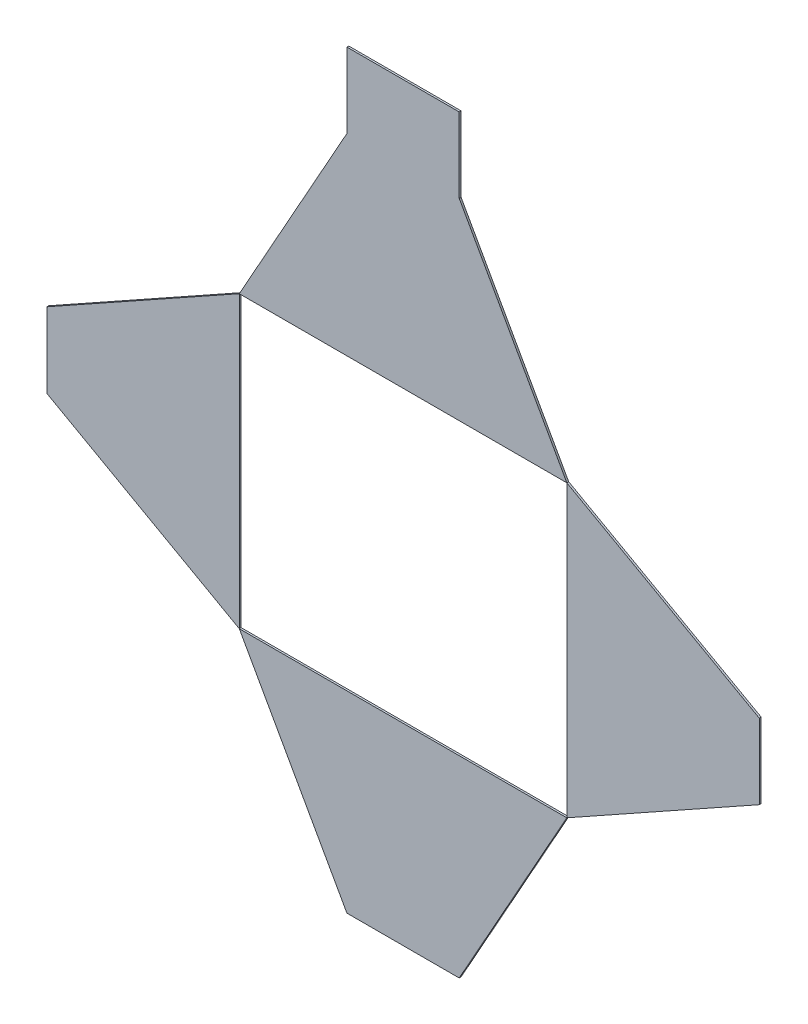
ISO-10303-21;
HEADER;
FILE_DESCRIPTION(('STEP AP214'),'2;1');
FILE_NAME('part.step','',(''),(''),'','','');
FILE_SCHEMA(('AUTOMOTIVE_DESIGN { 1 0 10303 214 1 1 1 1 }'));
ENDSEC;
DATA;
#1=APPLICATION_CONTEXT('core data for automotive mechanical design processes');
#2=APPLICATION_PROTOCOL_DEFINITION('international standard','automotive_design',2000,#1);
#3=PRODUCT_CONTEXT('',#1,'mechanical');
#4=PRODUCT('Part','Part','',(#3));
#5=PRODUCT_RELATED_PRODUCT_CATEGORY('part','',(#4));
#6=PRODUCT_DEFINITION_FORMATION('','',#4);
#7=PRODUCT_DEFINITION_CONTEXT('part definition',#1,'design');
#8=PRODUCT_DEFINITION('design','',#6,#7);
#9=PRODUCT_DEFINITION_SHAPE('','',#8);
#10=(LENGTH_UNIT() NAMED_UNIT(*) SI_UNIT(.MILLI.,.METRE.));
#11=(NAMED_UNIT(*) PLANE_ANGLE_UNIT() SI_UNIT($,.RADIAN.));
#12=(NAMED_UNIT(*) SI_UNIT($,.STERADIAN.) SOLID_ANGLE_UNIT());
#13=UNCERTAINTY_MEASURE_WITH_UNIT(LENGTH_MEASURE(1.E-05),#10,'distance_accuracy_value','');
#14=(GEOMETRIC_REPRESENTATION_CONTEXT(3) GLOBAL_UNCERTAINTY_ASSIGNED_CONTEXT((#13)) GLOBAL_UNIT_ASSIGNED_CONTEXT((#10,
#11,#12)) REPRESENTATION_CONTEXT('',''));
#15=CARTESIAN_POINT('',(0.,0.,0.));
#16=DIRECTION('',(0.,0.,1.));
#17=DIRECTION('',(1.,0.,0.));
#18=AXIS2_PLACEMENT_3D('',#15,#16,#17);
#19=CARTESIAN_POINT('',(-175.,0.,2.));
#20=DIRECTION('',(-1.,0.,0.));
#21=DIRECTION('',(0.,0.,1.));
#22=AXIS2_PLACEMENT_3D('',#19,#20,#21);
#23=PLANE('',#22);
#24=DIRECTION('',(0.,1.,0.));
#25=VECTOR('',#24,1.);
#26=CARTESIAN_POINT('',(-175.,0.,0.));
#27=LINE('',#26,#25);
#28=CARTESIAN_POINT('',(-175.,-155.,0.));
#29=VERTEX_POINT('',#28);
#30=CARTESIAN_POINT('',(-175.,155.,0.));
#31=VERTEX_POINT('',#30);
#32=EDGE_CURVE('E111',#29,#31,#27,.T.);
#33=ORIENTED_EDGE('',*,*,#32,.T.);
#34=DIRECTION('',(0.,0.,-1.));
#35=VECTOR('',#34,1.);
#36=CARTESIAN_POINT('',(-175.,155.,2.));
#37=LINE('',#36,#35);
#38=CARTESIAN_POINT('',(-175.,155.,2.));
#39=VERTEX_POINT('',#38);
#40=EDGE_CURVE('E12',#39,#31,#37,.T.);
#41=ORIENTED_EDGE('',*,*,#40,.F.);
#42=DIRECTION('',(0.,1.,0.));
#43=VECTOR('',#42,1.);
#44=CARTESIAN_POINT('',(-175.,0.,2.));
#45=LINE('',#44,#43);
#46=CARTESIAN_POINT('',(-175.,-155.,2.));
#47=VERTEX_POINT('',#46);
#48=EDGE_CURVE('E99',#47,#39,#45,.T.);
#49=ORIENTED_EDGE('',*,*,#48,.F.);
#50=DIRECTION('',(0.,0.,-1.));
#51=VECTOR('',#50,1.);
#52=CARTESIAN_POINT('',(-175.,-155.,2.));
#53=LINE('',#52,#51);
#54=EDGE_CURVE('E107',#47,#29,#53,.T.);
#55=ORIENTED_EDGE('',*,*,#54,.T.);
#56=EDGE_LOOP('',(#33,#41,#49,#55));
#57=FACE_BOUND('',#56,.T.);
#58=ADVANCED_FACE('F48',(#57),#23,.F.);
#59=CARTESIAN_POINT('',(-107.672917099578,192.632764301451,2.));
#60=DIRECTION('',(0.487908358082308,-0.872894858567414,0.));
#61=DIRECTION('',(0.872894858567415,0.487908358082308,0.));
#62=AXIS2_PLACEMENT_3D('',#59,#60,#61);
#63=PLANE('',#62);
#64=DIRECTION('',(-0.872894858567415,-0.487908358082308,0.));
#65=VECTOR('',#64,1.);
#66=CARTESIAN_POINT('',(-107.672917099578,192.632764301451,0.));
#67=LINE('',#66,#65);
#68=CARTESIAN_POINT('',(-380.74131816434,40.0000000000001,0.));
#69=VERTEX_POINT('',#68);
#70=EDGE_CURVE('E103',#31,#69,#67,.T.);
#71=ORIENTED_EDGE('',*,*,#70,.T.);
#72=DIRECTION('',(0.,0.,-1.));
#73=VECTOR('',#72,1.);
#74=CARTESIAN_POINT('',(-380.74131816434,40.0000000000001,2.));
#75=LINE('',#74,#73);
#76=CARTESIAN_POINT('',(-380.74131816434,40.0000000000001,2.));
#77=VERTEX_POINT('',#76);
#78=EDGE_CURVE('E56',#77,#69,#75,.T.);
#79=ORIENTED_EDGE('',*,*,#78,.F.);
#80=DIRECTION('',(-0.872894858567415,-0.487908358082308,0.));
#81=VECTOR('',#80,1.);
#82=CARTESIAN_POINT('',(-107.672917099578,192.632764301451,2.));
#83=LINE('',#82,#81);
#84=EDGE_CURVE('E94',#39,#77,#83,.T.);
#85=ORIENTED_EDGE('',*,*,#84,.F.);
#86=ORIENTED_EDGE('',*,*,#40,.T.);
#87=EDGE_LOOP('',(#71,#79,#85,#86));
#88=FACE_BOUND('',#87,.T.);
#89=ADVANCED_FACE('F102',(#88),#63,.F.);
#90=CARTESIAN_POINT('',(-380.74131816434,0.,2.));
#91=DIRECTION('',(1.,0.,0.));
#92=DIRECTION('',(0.,0.,-1.));
#93=AXIS2_PLACEMENT_3D('',#90,#91,#92);
#94=PLANE('',#93);
#95=DIRECTION('',(0.,-1.,0.));
#96=VECTOR('',#95,1.);
#97=CARTESIAN_POINT('',(-380.74131816434,0.,0.));
#98=LINE('',#97,#96);
#99=CARTESIAN_POINT('',(-380.741318164339,-39.9999999999999,0.));
#100=VERTEX_POINT('',#99);
#101=EDGE_CURVE('E81',#69,#100,#98,.T.);
#102=ORIENTED_EDGE('',*,*,#101,.T.);
#103=DIRECTION('',(0.,0.,-1.));
#104=VECTOR('',#103,1.);
#105=CARTESIAN_POINT('',(-380.741318164339,-39.9999999999999,2.));
#106=LINE('',#105,#104);
#107=CARTESIAN_POINT('',(-380.741318164339,-39.9999999999999,2.));
#108=VERTEX_POINT('',#107);
#109=EDGE_CURVE('E104',#108,#100,#106,.T.);
#110=ORIENTED_EDGE('',*,*,#109,.F.);
#111=DIRECTION('',(0.,-1.,0.));
#112=VECTOR('',#111,1.);
#113=CARTESIAN_POINT('',(-380.74131816434,0.,2.));
#114=LINE('',#113,#112);
#115=EDGE_CURVE('E97',#77,#108,#114,.T.);
#116=ORIENTED_EDGE('',*,*,#115,.F.);
#117=ORIENTED_EDGE('',*,*,#78,.T.);
#118=EDGE_LOOP('',(#102,#110,#116,#117));
#119=FACE_BOUND('',#118,.T.);
#120=ADVANCED_FACE('F105',(#119),#94,.F.);
#121=CARTESIAN_POINT('',(-107.672917099578,-192.632764301451,2.));
#122=DIRECTION('',(0.487908358082308,0.872894858567414,0.));
#123=DIRECTION('',(-0.872894858567414,0.487908358082308,0.));
#124=AXIS2_PLACEMENT_3D('',#121,#122,#123);
#125=PLANE('',#124);
#126=DIRECTION('',(0.872894858567414,-0.487908358082308,0.));
#127=VECTOR('',#126,1.);
#128=CARTESIAN_POINT('',(-107.672917099578,-192.632764301451,0.));
#129=LINE('',#128,#127);
#130=EDGE_CURVE('E87',#100,#29,#129,.T.);
#131=ORIENTED_EDGE('',*,*,#130,.T.);
#132=ORIENTED_EDGE('',*,*,#54,.F.);
#133=DIRECTION('',(0.872894858567414,-0.487908358082308,0.));
#134=VECTOR('',#133,1.);
#135=CARTESIAN_POINT('',(-107.672917099578,-192.632764301451,2.));
#136=LINE('',#135,#134);
#137=EDGE_CURVE('E64',#108,#47,#136,.T.);
#138=ORIENTED_EDGE('',*,*,#137,.F.);
#139=ORIENTED_EDGE('',*,*,#109,.T.);
#140=EDGE_LOOP('',(#131,#132,#138,#139));
#141=FACE_BOUND('',#140,.T.);
#142=ADVANCED_FACE('F118',(#141),#125,.F.);
#143=CARTESIAN_POINT('',(0.,0.,2.));
#144=DIRECTION('',(0.,0.,1.));
#145=DIRECTION('',(1.,0.,0.));
#146=AXIS2_PLACEMENT_3D('',#143,#144,#145);
#147=PLANE('',#146);
#148=ORIENTED_EDGE('',*,*,#48,.T.);
#149=ORIENTED_EDGE('',*,*,#84,.T.);
#150=ORIENTED_EDGE('',*,*,#115,.T.);
#151=ORIENTED_EDGE('',*,*,#137,.T.);
#152=EDGE_LOOP('',(#148,#149,#150,#151));
#153=FACE_BOUND('',#152,.T.);
#154=ADVANCED_FACE('F95',(#153),#147,.T.);
#155=CARTESIAN_POINT('',(0.,0.,0.));
#156=DIRECTION('',(0.,0.,1.));
#157=DIRECTION('',(1.,0.,0.));
#158=AXIS2_PLACEMENT_3D('',#155,#156,#157);
#159=PLANE('',#158);
#160=ORIENTED_EDGE('',*,*,#32,.F.);
#161=ORIENTED_EDGE('',*,*,#130,.F.);
#162=ORIENTED_EDGE('',*,*,#101,.F.);
#163=ORIENTED_EDGE('',*,*,#70,.F.);
#164=EDGE_LOOP('',(#160,#161,#162,#163));
#165=FACE_BOUND('',#164,.T.);
#166=ADVANCED_FACE('F121',(#165),#159,.F.);
#167=CLOSED_SHELL('',(#58,#89,#120,#142,#154,#166));
#168=MANIFOLD_SOLID_BREP('B2',#167);
#169=CARTESIAN_POINT('',(-199.353819039278,-111.429679726289,2.));
#170=DIRECTION('',(-0.872894858567414,-0.487908358082308,0.));
#171=DIRECTION('',(0.487908358082308,-0.872894858567414,0.));
#172=AXIS2_PLACEMENT_3D('',#169,#170,#171);
#173=PLANE('',#172);
#174=DIRECTION('',(-0.487908358082308,0.872894858567414,0.));
#175=VECTOR('',#174,1.);
#176=CARTESIAN_POINT('',(-199.353819039278,-111.429679726289,0.));
#177=LINE('',#176,#175);
#178=CARTESIAN_POINT('',(-59.9999999999999,-360.74131816434,0.));
#179=VERTEX_POINT('',#178);
#180=CARTESIAN_POINT('',(-175.,-155.,0.));
#181=VERTEX_POINT('',#180);
#182=EDGE_CURVE('E244',#179,#181,#177,.T.);
#183=ORIENTED_EDGE('',*,*,#182,.F.);
#184=DIRECTION('',(0.,0.,-1.));
#185=VECTOR('',#184,1.);
#186=CARTESIAN_POINT('',(-59.9999999999999,-360.74131816434,2.));
#187=LINE('',#186,#185);
#188=CARTESIAN_POINT('',(-59.9999999999999,-360.74131816434,2.));
#189=VERTEX_POINT('',#188);
#190=EDGE_CURVE('E46',#189,#179,#187,.T.);
#191=ORIENTED_EDGE('',*,*,#190,.F.);
#192=DIRECTION('',(-0.487908358082308,0.872894858567414,0.));
#193=VECTOR('',#192,1.);
#194=CARTESIAN_POINT('',(-199.353819039278,-111.429679726289,2.));
#195=LINE('',#194,#193);
#196=CARTESIAN_POINT('',(-175.,-155.,2.));
#197=VERTEX_POINT('',#196);
#198=EDGE_CURVE('E232',#189,#197,#195,.T.);
#199=ORIENTED_EDGE('',*,*,#198,.T.);
#200=DIRECTION('',(0.,0.,-1.));
#201=VECTOR('',#200,1.);
#202=CARTESIAN_POINT('',(-175.,-155.,2.));
#203=LINE('',#202,#201);
#204=EDGE_CURVE('E221',#197,#181,#203,.T.);
#205=ORIENTED_EDGE('',*,*,#204,.T.);
#206=EDGE_LOOP('',(#183,#191,#199,#205));
#207=FACE_BOUND('',#206,.T.);
#208=ADVANCED_FACE('F182',(#207),#173,.T.);
#209=CARTESIAN_POINT('',(3.33752764466399E-13,-360.74131816434,2.));
#210=DIRECTION('',(0.,1.,0.));
#211=DIRECTION('',(-1.,0.,0.));
#212=AXIS2_PLACEMENT_3D('',#209,#210,#211);
#213=PLANE('',#212);
#214=DIRECTION('',(1.,0.,0.));
#215=VECTOR('',#214,1.);
#216=CARTESIAN_POINT('',(3.33752764466399E-13,-360.74131816434,0.));
#217=LINE('',#216,#215);
#218=CARTESIAN_POINT('',(60.0000000000001,-360.741318164339,0.));
#219=VERTEX_POINT('',#218);
#220=EDGE_CURVE('E237',#179,#219,#217,.T.);
#221=ORIENTED_EDGE('',*,*,#220,.T.);
#222=DIRECTION('',(0.,0.,-1.));
#223=VECTOR('',#222,1.);
#224=CARTESIAN_POINT('',(60.0000000000001,-360.741318164339,2.));
#225=LINE('',#224,#223);
#226=CARTESIAN_POINT('',(60.0000000000001,-360.741318164339,2.));
#227=VERTEX_POINT('',#226);
#228=EDGE_CURVE('E190',#227,#219,#225,.T.);
#229=ORIENTED_EDGE('',*,*,#228,.F.);
#230=DIRECTION('',(1.,0.,0.));
#231=VECTOR('',#230,1.);
#232=CARTESIAN_POINT('',(3.33752764466399E-13,-360.74131816434,2.));
#233=LINE('',#232,#231);
#234=EDGE_CURVE('E227',#189,#227,#233,.T.);
#235=ORIENTED_EDGE('',*,*,#234,.F.);
#236=ORIENTED_EDGE('',*,*,#190,.T.);
#237=EDGE_LOOP('',(#221,#229,#235,#236));
#238=FACE_BOUND('',#237,.T.);
#239=ADVANCED_FACE('F235',(#238),#213,.F.);
#240=CARTESIAN_POINT('',(199.353819039278,-111.429679726289,2.));
#241=DIRECTION('',(-0.872894858567415,0.487908358082308,0.));
#242=DIRECTION('',(-0.487908358082308,-0.872894858567415,0.));
#243=AXIS2_PLACEMENT_3D('',#240,#241,#242);
#244=PLANE('',#243);
#245=DIRECTION('',(0.487908358082308,0.872894858567415,0.));
#246=VECTOR('',#245,1.);
#247=CARTESIAN_POINT('',(199.353819039278,-111.429679726289,0.));
#248=LINE('',#247,#246);
#249=CARTESIAN_POINT('',(175.,-155.,0.));
#250=VERTEX_POINT('',#249);
#251=EDGE_CURVE('E214',#219,#250,#248,.T.);
#252=ORIENTED_EDGE('',*,*,#251,.T.);
#253=DIRECTION('',(0.,0.,-1.));
#254=VECTOR('',#253,1.);
#255=CARTESIAN_POINT('',(175.,-155.,2.));
#256=LINE('',#255,#254);
#257=CARTESIAN_POINT('',(175.,-155.,2.));
#258=VERTEX_POINT('',#257);
#259=EDGE_CURVE('E238',#258,#250,#256,.T.);
#260=ORIENTED_EDGE('',*,*,#259,.F.);
#261=DIRECTION('',(0.487908358082308,0.872894858567415,0.));
#262=VECTOR('',#261,1.);
#263=CARTESIAN_POINT('',(199.353819039278,-111.429679726289,2.));
#264=LINE('',#263,#262);
#265=EDGE_CURVE('E231',#227,#258,#264,.T.);
#266=ORIENTED_EDGE('',*,*,#265,.F.);
#267=ORIENTED_EDGE('',*,*,#228,.T.);
#268=EDGE_LOOP('',(#252,#260,#266,#267));
#269=FACE_BOUND('',#268,.T.);
#270=ADVANCED_FACE('F239',(#269),#244,.F.);
#271=CARTESIAN_POINT('',(0.,-155.,2.));
#272=DIRECTION('',(0.,-1.,0.));
#273=DIRECTION('',(1.,0.,0.));
#274=AXIS2_PLACEMENT_3D('',#271,#272,#273);
#275=PLANE('',#274);
#276=DIRECTION('',(-1.,0.,0.));
#277=VECTOR('',#276,1.);
#278=CARTESIAN_POINT('',(0.,-155.,0.));
#279=LINE('',#278,#277);
#280=EDGE_CURVE('E249',#250,#181,#279,.T.);
#281=ORIENTED_EDGE('',*,*,#280,.T.);
#282=ORIENTED_EDGE('',*,*,#204,.F.);
#283=DIRECTION('',(-1.,0.,0.));
#284=VECTOR('',#283,1.);
#285=CARTESIAN_POINT('',(0.,-155.,2.));
#286=LINE('',#285,#284);
#287=EDGE_CURVE('E198',#258,#197,#286,.T.);
#288=ORIENTED_EDGE('',*,*,#287,.F.);
#289=ORIENTED_EDGE('',*,*,#259,.T.);
#290=EDGE_LOOP('',(#281,#282,#288,#289));
#291=FACE_BOUND('',#290,.T.);
#292=ADVANCED_FACE('F254',(#291),#275,.F.);
#293=CARTESIAN_POINT('',(0.,0.,2.));
#294=DIRECTION('',(0.,0.,1.));
#295=DIRECTION('',(1.,0.,0.));
#296=AXIS2_PLACEMENT_3D('',#293,#294,#295);
#297=PLANE('',#296);
#298=ORIENTED_EDGE('',*,*,#198,.F.);
#299=ORIENTED_EDGE('',*,*,#234,.T.);
#300=ORIENTED_EDGE('',*,*,#265,.T.);
#301=ORIENTED_EDGE('',*,*,#287,.T.);
#302=EDGE_LOOP('',(#298,#299,#300,#301));
#303=FACE_BOUND('',#302,.T.);
#304=ADVANCED_FACE('F229',(#303),#297,.T.);
#305=CARTESIAN_POINT('',(0.,0.,0.));
#306=DIRECTION('',(0.,0.,1.));
#307=DIRECTION('',(1.,0.,0.));
#308=AXIS2_PLACEMENT_3D('',#305,#306,#307);
#309=PLANE('',#308);
#310=ORIENTED_EDGE('',*,*,#182,.T.);
#311=ORIENTED_EDGE('',*,*,#280,.F.);
#312=ORIENTED_EDGE('',*,*,#251,.F.);
#313=ORIENTED_EDGE('',*,*,#220,.F.);
#314=EDGE_LOOP('',(#310,#311,#312,#313));
#315=FACE_BOUND('',#314,.T.);
#316=ADVANCED_FACE('F256',(#315),#309,.F.);
#317=CLOSED_SHELL('',(#208,#239,#270,#292,#304,#316));
#318=MANIFOLD_SOLID_BREP('B6',#317);
#319=CARTESIAN_POINT('',(107.672917099578,-192.632764301451,2.));
#320=DIRECTION('',(0.487908358082308,-0.872894858567414,0.));
#321=DIRECTION('',(0.872894858567414,0.487908358082308,0.));
#322=AXIS2_PLACEMENT_3D('',#319,#320,#321);
#323=PLANE('',#322);
#324=DIRECTION('',(-0.872894858567414,-0.487908358082308,0.));
#325=VECTOR('',#324,1.);
#326=CARTESIAN_POINT('',(107.672917099578,-192.632764301451,0.));
#327=LINE('',#326,#325);
#328=CARTESIAN_POINT('',(380.74131816434,-39.9999999999999,0.));
#329=VERTEX_POINT('',#328);
#330=CARTESIAN_POINT('',(175.,-155.,0.));
#331=VERTEX_POINT('',#330);
#332=EDGE_CURVE('E378',#329,#331,#327,.T.);
#333=ORIENTED_EDGE('',*,*,#332,.F.);
#334=DIRECTION('',(0.,0.,-1.));
#335=VECTOR('',#334,1.);
#336=CARTESIAN_POINT('',(380.74131816434,-39.9999999999999,2.));
#337=LINE('',#336,#335);
#338=CARTESIAN_POINT('',(380.74131816434,-39.9999999999999,2.));
#339=VERTEX_POINT('',#338);
#340=EDGE_CURVE('E180',#339,#329,#337,.T.);
#341=ORIENTED_EDGE('',*,*,#340,.F.);
#342=DIRECTION('',(-0.872894858567414,-0.487908358082308,0.));
#343=VECTOR('',#342,1.);
#344=CARTESIAN_POINT('',(107.672917099578,-192.632764301451,2.));
#345=LINE('',#344,#343);
#346=CARTESIAN_POINT('',(175.,-155.,2.));
#347=VERTEX_POINT('',#346);
#348=EDGE_CURVE('E370',#339,#347,#345,.T.);
#349=ORIENTED_EDGE('',*,*,#348,.T.);
#350=DIRECTION('',(0.,0.,-1.));
#351=VECTOR('',#350,1.);
#352=CARTESIAN_POINT('',(175.,-155.,2.));
#353=LINE('',#352,#351);
#354=EDGE_CURVE('E331',#347,#331,#353,.T.);
#355=ORIENTED_EDGE('',*,*,#354,.T.);
#356=EDGE_LOOP('',(#333,#341,#349,#355));
#357=FACE_BOUND('',#356,.T.);
#358=ADVANCED_FACE('F315',(#357),#323,.T.);
#359=CARTESIAN_POINT('',(380.74131816434,0.,2.));
#360=DIRECTION('',(1.,0.,0.));
#361=DIRECTION('',(0.,0.,-1.));
#362=AXIS2_PLACEMENT_3D('',#359,#360,#361);
#363=PLANE('',#362);
#364=DIRECTION('',(0.,-1.,0.));
#365=VECTOR('',#364,1.);
#366=CARTESIAN_POINT('',(380.74131816434,0.,0.));
#367=LINE('',#366,#365);
#368=CARTESIAN_POINT('',(380.74131816434,40.0000000000001,0.));
#369=VERTEX_POINT('',#368);
#370=EDGE_CURVE('E361',#369,#329,#367,.T.);
#371=ORIENTED_EDGE('',*,*,#370,.F.);
#372=DIRECTION('',(0.,0.,-1.));
#373=VECTOR('',#372,1.);
#374=CARTESIAN_POINT('',(380.74131816434,40.0000000000001,2.));
#375=LINE('',#374,#373);
#376=CARTESIAN_POINT('',(380.74131816434,40.0000000000001,2.));
#377=VERTEX_POINT('',#376);
#378=EDGE_CURVE('E323',#377,#369,#375,.T.);
#379=ORIENTED_EDGE('',*,*,#378,.F.);
#380=DIRECTION('',(0.,-1.,0.));
#381=VECTOR('',#380,1.);
#382=CARTESIAN_POINT('',(380.74131816434,0.,2.));
#383=LINE('',#382,#381);
#384=EDGE_CURVE('E359',#377,#339,#383,.T.);
#385=ORIENTED_EDGE('',*,*,#384,.T.);
#386=ORIENTED_EDGE('',*,*,#340,.T.);
#387=EDGE_LOOP('',(#371,#379,#385,#386));
#388=FACE_BOUND('',#387,.T.);
#389=ADVANCED_FACE('F358',(#388),#363,.T.);
#390=CARTESIAN_POINT('',(107.672917099578,192.632764301451,2.));
#391=DIRECTION('',(0.487908358082308,0.872894858567414,0.));
#392=DIRECTION('',(-0.872894858567414,0.487908358082308,0.));
#393=AXIS2_PLACEMENT_3D('',#390,#391,#392);
#394=PLANE('',#393);
#395=DIRECTION('',(0.872894858567414,-0.487908358082308,0.));
#396=VECTOR('',#395,1.);
#397=CARTESIAN_POINT('',(107.672917099578,192.632764301451,0.));
#398=LINE('',#397,#396);
#399=CARTESIAN_POINT('',(175.,155.,0.));
#400=VERTEX_POINT('',#399);
#401=EDGE_CURVE('E381',#400,#369,#398,.T.);
#402=ORIENTED_EDGE('',*,*,#401,.F.);
#403=DIRECTION('',(0.,0.,-1.));
#404=VECTOR('',#403,1.);
#405=CARTESIAN_POINT('',(175.,155.,2.));
#406=LINE('',#405,#404);
#407=CARTESIAN_POINT('',(175.,155.,2.));
#408=VERTEX_POINT('',#407);
#409=EDGE_CURVE('E344',#408,#400,#406,.T.);
#410=ORIENTED_EDGE('',*,*,#409,.F.);
#411=DIRECTION('',(0.872894858567414,-0.487908358082308,0.));
#412=VECTOR('',#411,1.);
#413=CARTESIAN_POINT('',(107.672917099578,192.632764301451,2.));
#414=LINE('',#413,#412);
#415=EDGE_CURVE('E369',#408,#377,#414,.T.);
#416=ORIENTED_EDGE('',*,*,#415,.T.);
#417=ORIENTED_EDGE('',*,*,#378,.T.);
#418=EDGE_LOOP('',(#402,#410,#416,#417));
#419=FACE_BOUND('',#418,.T.);
#420=ADVANCED_FACE('F372',(#419),#394,.T.);
#421=CARTESIAN_POINT('',(175.,0.,2.));
#422=DIRECTION('',(-1.,0.,0.));
#423=DIRECTION('',(0.,0.,1.));
#424=AXIS2_PLACEMENT_3D('',#421,#422,#423);
#425=PLANE('',#424);
#426=DIRECTION('',(0.,1.,0.));
#427=VECTOR('',#426,1.);
#428=CARTESIAN_POINT('',(175.,0.,0.));
#429=LINE('',#428,#427);
#430=EDGE_CURVE('E383',#331,#400,#429,.T.);
#431=ORIENTED_EDGE('',*,*,#430,.F.);
#432=ORIENTED_EDGE('',*,*,#354,.F.);
#433=DIRECTION('',(0.,1.,0.));
#434=VECTOR('',#433,1.);
#435=CARTESIAN_POINT('',(175.,0.,2.));
#436=LINE('',#435,#434);
#437=EDGE_CURVE('E373',#347,#408,#436,.T.);
#438=ORIENTED_EDGE('',*,*,#437,.T.);
#439=ORIENTED_EDGE('',*,*,#409,.T.);
#440=EDGE_LOOP('',(#431,#432,#438,#439));
#441=FACE_BOUND('',#440,.T.);
#442=ADVANCED_FACE('F388',(#441),#425,.T.);
#443=CARTESIAN_POINT('',(0.,0.,2.));
#444=DIRECTION('',(0.,0.,1.));
#445=DIRECTION('',(1.,0.,0.));
#446=AXIS2_PLACEMENT_3D('',#443,#444,#445);
#447=PLANE('',#446);
#448=ORIENTED_EDGE('',*,*,#348,.F.);
#449=ORIENTED_EDGE('',*,*,#384,.F.);
#450=ORIENTED_EDGE('',*,*,#415,.F.);
#451=ORIENTED_EDGE('',*,*,#437,.F.);
#452=EDGE_LOOP('',(#448,#449,#450,#451));
#453=FACE_BOUND('',#452,.T.);
#454=ADVANCED_FACE('F367',(#453),#447,.T.);
#455=CARTESIAN_POINT('',(0.,0.,0.));
#456=DIRECTION('',(0.,0.,1.));
#457=DIRECTION('',(1.,0.,0.));
#458=AXIS2_PLACEMENT_3D('',#455,#456,#457);
#459=PLANE('',#458);
#460=ORIENTED_EDGE('',*,*,#332,.T.);
#461=ORIENTED_EDGE('',*,*,#430,.T.);
#462=ORIENTED_EDGE('',*,*,#401,.T.);
#463=ORIENTED_EDGE('',*,*,#370,.T.);
#464=EDGE_LOOP('',(#460,#461,#462,#463));
#465=FACE_BOUND('',#464,.T.);
#466=ADVANCED_FACE('F395',(#465),#459,.F.);
#467=CLOSED_SHELL('',(#358,#389,#420,#442,#454,#466));
#468=MANIFOLD_SOLID_BREP('B40',#467);
#469=CARTESIAN_POINT('',(59.9999999999999,0.,2.));
#470=DIRECTION('',(1.,0.,0.));
#471=DIRECTION('',(0.,1.,0.));
#472=AXIS2_PLACEMENT_3D('',#469,#470,#471);
#473=PLANE('',#472);
#474=DIRECTION('',(0.,-1.,0.));
#475=VECTOR('',#474,1.);
#476=CARTESIAN_POINT('',(59.9999999999999,0.,0.));
#477=LINE('',#476,#475);
#478=CARTESIAN_POINT('',(60.,440.74131816434,0.));
#479=VERTEX_POINT('',#478);
#480=CARTESIAN_POINT('',(60.,360.74131816434,0.));
#481=VERTEX_POINT('',#480);
#482=EDGE_CURVE('E520',#479,#481,#477,.T.);
#483=ORIENTED_EDGE('',*,*,#482,.F.);
#484=DIRECTION('',(0.,0.,-1.));
#485=VECTOR('',#484,1.);
#486=CARTESIAN_POINT('',(60.,440.74131816434,2.));
#487=LINE('',#486,#485);
#488=CARTESIAN_POINT('',(60.,440.74131816434,2.));
#489=VERTEX_POINT('',#488);
#490=EDGE_CURVE('E313',#489,#479,#487,.T.);
#491=ORIENTED_EDGE('',*,*,#490,.F.);
#492=DIRECTION('',(0.,-1.,0.));
#493=VECTOR('',#492,1.);
#494=CARTESIAN_POINT('',(59.9999999999999,0.,2.));
#495=LINE('',#494,#493);
#496=CARTESIAN_POINT('',(60.,360.74131816434,2.));
#497=VERTEX_POINT('',#496);
#498=EDGE_CURVE('E534',#489,#497,#495,.T.);
#499=ORIENTED_EDGE('',*,*,#498,.T.);
#500=DIRECTION('',(0.,0.,-1.));
#501=VECTOR('',#500,1.);
#502=CARTESIAN_POINT('',(60.,360.74131816434,2.));
#503=LINE('',#502,#501);
#504=EDGE_CURVE('E455',#497,#481,#503,.T.);
#505=ORIENTED_EDGE('',*,*,#504,.T.);
#506=EDGE_LOOP('',(#483,#491,#499,#505));
#507=FACE_BOUND('',#506,.T.);
#508=ADVANCED_FACE('F439',(#507),#473,.T.);
#509=CARTESIAN_POINT('',(0.,440.74131816434,2.));
#510=DIRECTION('',(0.,1.,0.));
#511=DIRECTION('',(0.,0.,1.));
#512=AXIS2_PLACEMENT_3D('',#509,#510,#511);
#513=PLANE('',#512);
#514=DIRECTION('',(1.,0.,0.));
#515=VECTOR('',#514,1.);
#516=CARTESIAN_POINT('',(0.,440.74131816434,0.));
#517=LINE('',#516,#515);
#518=CARTESIAN_POINT('',(-60.,440.74131816434,0.));
#519=VERTEX_POINT('',#518);
#520=EDGE_CURVE('E522',#519,#479,#517,.T.);
#521=ORIENTED_EDGE('',*,*,#520,.F.);
#522=DIRECTION('',(0.,0.,-1.));
#523=VECTOR('',#522,1.);
#524=CARTESIAN_POINT('',(-60.,440.74131816434,2.));
#525=LINE('',#524,#523);
#526=CARTESIAN_POINT('',(-60.,440.74131816434,2.));
#527=VERTEX_POINT('',#526);
#528=EDGE_CURVE('E447',#527,#519,#525,.T.);
#529=ORIENTED_EDGE('',*,*,#528,.F.);
#530=DIRECTION('',(1.,0.,0.));
#531=VECTOR('',#530,1.);
#532=CARTESIAN_POINT('',(0.,440.74131816434,2.));
#533=LINE('',#532,#531);
#534=EDGE_CURVE('E615',#527,#489,#533,.T.);
#535=ORIENTED_EDGE('',*,*,#534,.T.);
#536=ORIENTED_EDGE('',*,*,#490,.T.);
#537=EDGE_LOOP('',(#521,#529,#535,#536));
#538=FACE_BOUND('',#537,.T.);
#539=ADVANCED_FACE('F543',(#538),#513,.T.);
#540=CARTESIAN_POINT('',(-59.9999999999999,0.,2.));
#541=DIRECTION('',(-1.,0.,0.));
#542=DIRECTION('',(0.,-1.,0.));
#543=AXIS2_PLACEMENT_3D('',#540,#541,#542);
#544=PLANE('',#543);
#545=DIRECTION('',(0.,1.,0.));
#546=VECTOR('',#545,1.);
#547=CARTESIAN_POINT('',(-59.9999999999999,0.,0.));
#548=LINE('',#547,#546);
#549=CARTESIAN_POINT('',(-60.,360.74131816434,0.));
#550=VERTEX_POINT('',#549);
#551=EDGE_CURVE('E525',#550,#519,#548,.T.);
#552=ORIENTED_EDGE('',*,*,#551,.F.);
#553=DIRECTION('',(0.,0.,-1.));
#554=VECTOR('',#553,1.);
#555=CARTESIAN_POINT('',(-60.,360.74131816434,2.));
#556=LINE('',#555,#554);
#557=CARTESIAN_POINT('',(-60.,360.74131816434,2.));
#558=VERTEX_POINT('',#557);
#559=EDGE_CURVE('E512',#558,#550,#556,.T.);
#560=ORIENTED_EDGE('',*,*,#559,.F.);
#561=DIRECTION('',(0.,1.,0.));
#562=VECTOR('',#561,1.);
#563=CARTESIAN_POINT('',(-59.9999999999999,0.,2.));
#564=LINE('',#563,#562);
#565=EDGE_CURVE('E502',#558,#527,#564,.T.);
#566=ORIENTED_EDGE('',*,*,#565,.T.);
#567=ORIENTED_EDGE('',*,*,#528,.T.);
#568=EDGE_LOOP('',(#552,#560,#566,#567));
#569=FACE_BOUND('',#568,.T.);
#570=ADVANCED_FACE('F540',(#569),#544,.T.);
#571=CARTESIAN_POINT('',(-199.353819039278,111.429679726289,2.));
#572=DIRECTION('',(0.872894858567414,-0.487908358082308,0.));
#573=DIRECTION('',(0.487908358082308,0.872894858567414,0.));
#574=AXIS2_PLACEMENT_3D('',#571,#572,#573);
#575=PLANE('',#574);
#576=DIRECTION('',(-0.487908358082308,-0.872894858567414,0.));
#577=VECTOR('',#576,1.);
#578=CARTESIAN_POINT('',(-199.353819039278,111.429679726289,0.));
#579=LINE('',#578,#577);
#580=CARTESIAN_POINT('',(-175.,155.,0.));
#581=VERTEX_POINT('',#580);
#582=EDGE_CURVE('E509',#550,#581,#579,.T.);
#583=ORIENTED_EDGE('',*,*,#582,.T.);
#584=DIRECTION('',(0.,0.,-1.));
#585=VECTOR('',#584,1.);
#586=CARTESIAN_POINT('',(-175.,155.,2.));
#587=LINE('',#586,#585);
#588=CARTESIAN_POINT('',(-175.,155.,2.));
#589=VERTEX_POINT('',#588);
#590=EDGE_CURVE('E506',#589,#581,#587,.T.);
#591=ORIENTED_EDGE('',*,*,#590,.F.);
#592=DIRECTION('',(-0.487908358082308,-0.872894858567414,0.));
#593=VECTOR('',#592,1.);
#594=CARTESIAN_POINT('',(-199.353819039278,111.429679726289,2.));
#595=LINE('',#594,#593);
#596=EDGE_CURVE('E494',#558,#589,#595,.T.);
#597=ORIENTED_EDGE('',*,*,#596,.F.);
#598=ORIENTED_EDGE('',*,*,#559,.T.);
#599=EDGE_LOOP('',(#583,#591,#597,#598));
#600=FACE_BOUND('',#599,.T.);
#601=ADVANCED_FACE('F507',(#600),#575,.F.);
#602=CARTESIAN_POINT('',(0.,155.,2.));
#603=DIRECTION('',(0.,-1.,0.));
#604=DIRECTION('',(1.,0.,0.));
#605=AXIS2_PLACEMENT_3D('',#602,#603,#604);
#606=PLANE('',#605);
#607=DIRECTION('',(-1.,0.,0.));
#608=VECTOR('',#607,1.);
#609=CARTESIAN_POINT('',(0.,155.,0.));
#610=LINE('',#609,#608);
#611=CARTESIAN_POINT('',(175.,155.,0.));
#612=VERTEX_POINT('',#611);
#613=EDGE_CURVE('E529',#612,#581,#610,.T.);
#614=ORIENTED_EDGE('',*,*,#613,.F.);
#615=DIRECTION('',(0.,0.,-1.));
#616=VECTOR('',#615,1.);
#617=CARTESIAN_POINT('',(175.,155.,2.));
#618=LINE('',#617,#616);
#619=CARTESIAN_POINT('',(175.,155.,2.));
#620=VERTEX_POINT('',#619);
#621=EDGE_CURVE('E474',#620,#612,#618,.T.);
#622=ORIENTED_EDGE('',*,*,#621,.F.);
#623=DIRECTION('',(-1.,0.,0.));
#624=VECTOR('',#623,1.);
#625=CARTESIAN_POINT('',(0.,155.,2.));
#626=LINE('',#625,#624);
#627=EDGE_CURVE('E499',#620,#589,#626,.T.);
#628=ORIENTED_EDGE('',*,*,#627,.T.);
#629=ORIENTED_EDGE('',*,*,#590,.T.);
#630=EDGE_LOOP('',(#614,#622,#628,#629));
#631=FACE_BOUND('',#630,.T.);
#632=ADVANCED_FACE('F514',(#631),#606,.T.);
#633=CARTESIAN_POINT('',(199.353819039278,111.429679726289,2.));
#634=DIRECTION('',(0.872894858567414,0.487908358082308,0.));
#635=DIRECTION('',(-0.487908358082308,0.872894858567414,0.));
#636=AXIS2_PLACEMENT_3D('',#633,#634,#635);
#637=PLANE('',#636);
#638=DIRECTION('',(0.487908358082308,-0.872894858567414,0.));
#639=VECTOR('',#638,1.);
#640=CARTESIAN_POINT('',(199.353819039278,111.429679726289,0.));
#641=LINE('',#640,#639);
#642=EDGE_CURVE('E531',#481,#612,#641,.T.);
#643=ORIENTED_EDGE('',*,*,#642,.F.);
#644=ORIENTED_EDGE('',*,*,#504,.F.);
#645=DIRECTION('',(0.487908358082308,-0.872894858567414,0.));
#646=VECTOR('',#645,1.);
#647=CARTESIAN_POINT('',(199.353819039278,111.429679726289,2.));
#648=LINE('',#647,#646);
#649=EDGE_CURVE('E515',#497,#620,#648,.T.);
#650=ORIENTED_EDGE('',*,*,#649,.T.);
#651=ORIENTED_EDGE('',*,*,#621,.T.);
#652=EDGE_LOOP('',(#643,#644,#650,#651));
#653=FACE_BOUND('',#652,.T.);
#654=ADVANCED_FACE('F546',(#653),#637,.T.);
#655=CARTESIAN_POINT('',(0.,0.,2.));
#656=DIRECTION('',(0.,0.,1.));
#657=DIRECTION('',(1.,0.,0.));
#658=AXIS2_PLACEMENT_3D('',#655,#656,#657);
#659=PLANE('',#658);
#660=ORIENTED_EDGE('',*,*,#498,.F.);
#661=ORIENTED_EDGE('',*,*,#534,.F.);
#662=ORIENTED_EDGE('',*,*,#565,.F.);
#663=ORIENTED_EDGE('',*,*,#596,.T.);
#664=ORIENTED_EDGE('',*,*,#627,.F.);
#665=ORIENTED_EDGE('',*,*,#649,.F.);
#666=EDGE_LOOP('',(#660,#661,#662,#663,#664,#665));
#667=FACE_BOUND('',#666,.T.);
#668=ADVANCED_FACE('F496',(#667),#659,.T.);
#669=CARTESIAN_POINT('',(0.,0.,0.));
#670=DIRECTION('',(0.,0.,1.));
#671=DIRECTION('',(1.,0.,0.));
#672=AXIS2_PLACEMENT_3D('',#669,#670,#671);
#673=PLANE('',#672);
#674=ORIENTED_EDGE('',*,*,#482,.T.);
#675=ORIENTED_EDGE('',*,*,#642,.T.);
#676=ORIENTED_EDGE('',*,*,#613,.T.);
#677=ORIENTED_EDGE('',*,*,#582,.F.);
#678=ORIENTED_EDGE('',*,*,#551,.T.);
#679=ORIENTED_EDGE('',*,*,#520,.T.);
#680=EDGE_LOOP('',(#674,#675,#676,#677,#678,#679));
#681=FACE_BOUND('',#680,.T.);
#682=ADVANCED_FACE('F545',(#681),#673,.F.);
#683=CLOSED_SHELL('',(#508,#539,#570,#601,#632,#654,#668,#682));
#684=MANIFOLD_SOLID_BREP('B174',#683);
#685=ADVANCED_BREP_SHAPE_REPRESENTATION('',(#18,#168,#318,#468,#684),#14);
#686=SHAPE_DEFINITION_REPRESENTATION(#9,#685);
ENDSEC;
END-ISO-10303-21;
